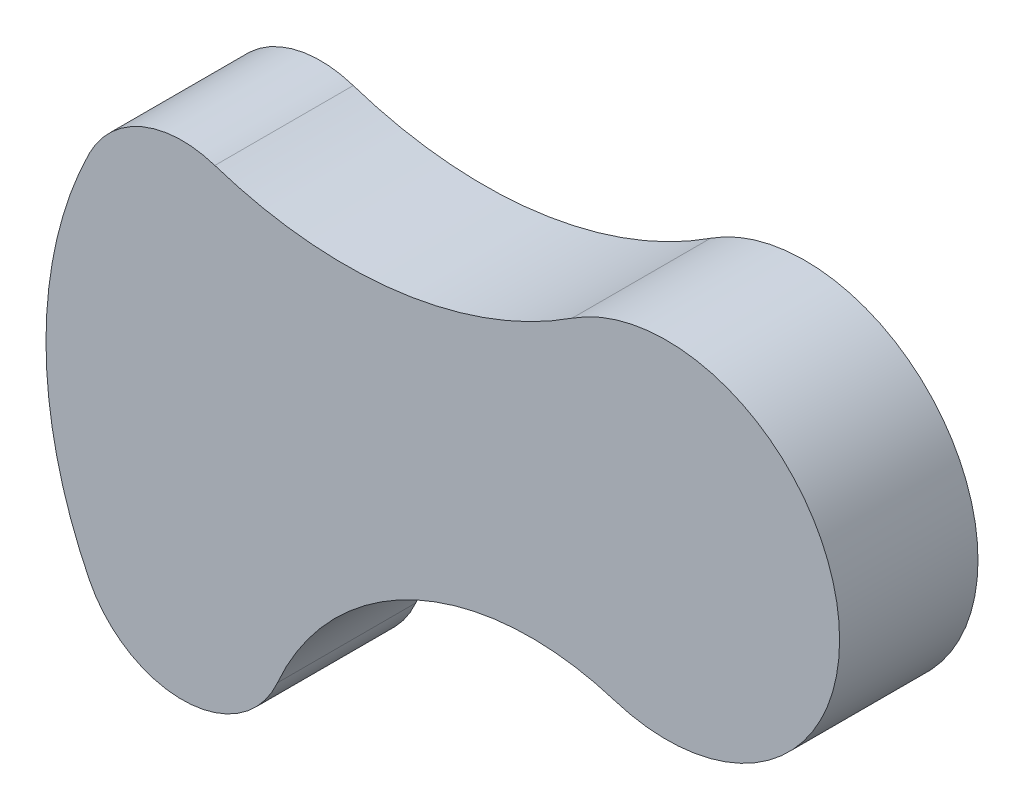
ISO-10303-21;
HEADER;
FILE_DESCRIPTION(('STEP AP214'),'2;1');
FILE_NAME('part.step','',(''),(''),'','','');
FILE_SCHEMA(('AUTOMOTIVE_DESIGN { 1 0 10303 214 1 1 1 1 }'));
ENDSEC;
DATA;
#1=APPLICATION_CONTEXT('core data for automotive mechanical design processes');
#2=APPLICATION_PROTOCOL_DEFINITION('international standard','automotive_design',2000,#1);
#3=PRODUCT_CONTEXT('',#1,'mechanical');
#4=PRODUCT('Part','Part','',(#3));
#5=PRODUCT_RELATED_PRODUCT_CATEGORY('part','',(#4));
#6=PRODUCT_DEFINITION_FORMATION('','',#4);
#7=PRODUCT_DEFINITION_CONTEXT('part definition',#1,'design');
#8=PRODUCT_DEFINITION('design','',#6,#7);
#9=PRODUCT_DEFINITION_SHAPE('','',#8);
#10=(LENGTH_UNIT() NAMED_UNIT(*) SI_UNIT(.MILLI.,.METRE.));
#11=(NAMED_UNIT(*) PLANE_ANGLE_UNIT() SI_UNIT($,.RADIAN.));
#12=(NAMED_UNIT(*) SI_UNIT($,.STERADIAN.) SOLID_ANGLE_UNIT());
#13=UNCERTAINTY_MEASURE_WITH_UNIT(LENGTH_MEASURE(1.E-05),#10,'distance_accuracy_value','');
#14=(GEOMETRIC_REPRESENTATION_CONTEXT(3) GLOBAL_UNCERTAINTY_ASSIGNED_CONTEXT((#13)) GLOBAL_UNIT_ASSIGNED_CONTEXT((#10,
#11,#12)) REPRESENTATION_CONTEXT('',''));
#15=CARTESIAN_POINT('',(0.,0.,0.));
#16=DIRECTION('',(0.,0.,1.));
#17=DIRECTION('',(1.,0.,0.));
#18=AXIS2_PLACEMENT_3D('',#15,#16,#17);
#19=CARTESIAN_POINT('',(-23.2142857142857,35.5998165553632,10.));
#20=DIRECTION('',(0.,0.,-1.));
#21=DIRECTION('',(-1.,0.,0.));
#22=AXIS2_PLACEMENT_3D('',#19,#20,#21);
#23=CYLINDRICAL_SURFACE('',#22,30.);
#24=CARTESIAN_POINT('',(-23.2142857142857,35.5998165553632,0.));
#25=DIRECTION('',(0.,0.,-1.));
#26=DIRECTION('',(1.,0.,0.));
#27=AXIS2_PLACEMENT_3D('',#24,#25,#26);
#28=CIRCLE('',#27,30.);
#29=CARTESIAN_POINT('',(-6.82773109243699,10.4705342809892,0.));
#30=VERTEX_POINT('',#29);
#31=CARTESIAN_POINT('',(-32.6428571428571,7.11996331107264,0.));
#32=VERTEX_POINT('',#31);
#33=EDGE_CURVE('E123',#30,#32,#28,.T.);
#34=ORIENTED_EDGE('',*,*,#33,.T.);
#35=DIRECTION('',(0.,0.,-1.));
#36=VECTOR('',#35,1.);
#37=CARTESIAN_POINT('',(-32.6428571428571,7.11996331107264,10.));
#38=LINE('',#37,#36);
#39=CARTESIAN_POINT('',(-32.6428571428571,7.11996331107264,10.));
#40=VERTEX_POINT('',#39);
#41=EDGE_CURVE('E11',#40,#32,#38,.T.);
#42=ORIENTED_EDGE('',*,*,#41,.F.);
#43=CARTESIAN_POINT('',(-23.2142857142857,35.5998165553632,10.));
#44=DIRECTION('',(0.,0.,-1.));
#45=DIRECTION('',(1.,0.,0.));
#46=AXIS2_PLACEMENT_3D('',#43,#44,#45);
#47=CIRCLE('',#46,30.);
#48=CARTESIAN_POINT('',(-6.82773109243699,10.4705342809892,10.));
#49=VERTEX_POINT('',#48);
#50=EDGE_CURVE('E133',#49,#40,#47,.T.);
#51=ORIENTED_EDGE('',*,*,#50,.F.);
#52=DIRECTION('',(0.,0.,-1.));
#53=VECTOR('',#52,1.);
#54=CARTESIAN_POINT('',(-6.82773109243699,10.4705342809892,10.));
#55=LINE('',#54,#53);
#56=EDGE_CURVE('E119',#49,#30,#55,.T.);
#57=ORIENTED_EDGE('',*,*,#56,.T.);
#58=EDGE_LOOP('',(#34,#42,#51,#57));
#59=FACE_BOUND('',#58,.T.);
#60=ADVANCED_FACE('F39',(#59),#23,.F.);
#61=CARTESIAN_POINT('',(-35.,0.,10.));
#62=DIRECTION('',(0.,0.,-1.));
#63=DIRECTION('',(-1.,0.,0.));
#64=AXIS2_PLACEMENT_3D('',#61,#62,#63);
#65=CYLINDRICAL_SURFACE('',#64,7.50000000000001);
#66=CARTESIAN_POINT('',(-35.,0.,0.));
#67=DIRECTION('',(0.,0.,1.));
#68=DIRECTION('',(1.,0.,0.));
#69=AXIS2_PLACEMENT_3D('',#66,#67,#68);
#70=CIRCLE('',#69,7.50000000000001);
#71=CARTESIAN_POINT('',(-41.7185481235821,3.33333333333333,0.));
#72=VERTEX_POINT('',#71);
#73=EDGE_CURVE('E126',#32,#72,#70,.T.);
#74=ORIENTED_EDGE('',*,*,#73,.T.);
#75=DIRECTION('',(0.,0.,-1.));
#76=VECTOR('',#75,1.);
#77=CARTESIAN_POINT('',(-41.7185481235821,3.33333333333333,10.));
#78=LINE('',#77,#76);
#79=CARTESIAN_POINT('',(-41.7185481235821,3.33333333333333,10.));
#80=VERTEX_POINT('',#79);
#81=EDGE_CURVE('E47',#80,#72,#78,.T.);
#82=ORIENTED_EDGE('',*,*,#81,.F.);
#83=CARTESIAN_POINT('',(-35.,0.,10.));
#84=DIRECTION('',(0.,0.,1.));
#85=DIRECTION('',(1.,0.,0.));
#86=AXIS2_PLACEMENT_3D('',#83,#84,#85);
#87=CIRCLE('',#86,7.50000000000001);
#88=EDGE_CURVE('E92',#40,#80,#87,.T.);
#89=ORIENTED_EDGE('',*,*,#88,.F.);
#90=ORIENTED_EDGE('',*,*,#41,.T.);
#91=EDGE_LOOP('',(#74,#82,#89,#90));
#92=FACE_BOUND('',#91,.T.);
#93=ADVANCED_FACE('F157',(#92),#65,.T.);
#94=CARTESIAN_POINT('',(-14.8443556292536,-10.,10.));
#95=DIRECTION('',(0.,0.,-1.));
#96=DIRECTION('',(-1.,0.,0.));
#97=AXIS2_PLACEMENT_3D('',#94,#95,#96);
#98=CYLINDRICAL_SURFACE('',#97,30.);
#99=CARTESIAN_POINT('',(-14.8443556292536,-10.,0.));
#100=DIRECTION('',(0.,0.,1.));
#101=DIRECTION('',(-1.,0.,0.));
#102=AXIS2_PLACEMENT_3D('',#99,#100,#101);
#103=CIRCLE('',#102,30.);
#104=CARTESIAN_POINT('',(-41.7185481235821,-23.3333333333334,0.));
#105=VERTEX_POINT('',#104);
#106=EDGE_CURVE('E128',#72,#105,#103,.T.);
#107=ORIENTED_EDGE('',*,*,#106,.T.);
#108=DIRECTION('',(0.,0.,-1.));
#109=VECTOR('',#108,1.);
#110=CARTESIAN_POINT('',(-41.7185481235821,-23.3333333333334,10.));
#111=LINE('',#110,#109);
#112=CARTESIAN_POINT('',(-41.7185481235821,-23.3333333333334,10.));
#113=VERTEX_POINT('',#112);
#114=EDGE_CURVE('E114',#113,#105,#111,.T.);
#115=ORIENTED_EDGE('',*,*,#114,.F.);
#116=CARTESIAN_POINT('',(-14.8443556292536,-10.,10.));
#117=DIRECTION('',(0.,0.,1.));
#118=DIRECTION('',(-1.,0.,0.));
#119=AXIS2_PLACEMENT_3D('',#116,#117,#118);
#120=CIRCLE('',#119,30.);
#121=EDGE_CURVE('E105',#80,#113,#120,.T.);
#122=ORIENTED_EDGE('',*,*,#121,.F.);
#123=ORIENTED_EDGE('',*,*,#81,.T.);
#124=EDGE_LOOP('',(#107,#115,#122,#123));
#125=FACE_BOUND('',#124,.T.);
#126=ADVANCED_FACE('F139',(#125),#98,.T.);
#127=CARTESIAN_POINT('',(-35.,-20.,10.));
#128=DIRECTION('',(0.,0.,-1.));
#129=DIRECTION('',(-1.,0.,0.));
#130=AXIS2_PLACEMENT_3D('',#127,#128,#129);
#131=CYLINDRICAL_SURFACE('',#130,7.50000000000001);
#132=CARTESIAN_POINT('',(-35.,-20.,0.));
#133=DIRECTION('',(0.,0.,1.));
#134=DIRECTION('',(1.,0.,0.));
#135=AXIS2_PLACEMENT_3D('',#132,#133,#134);
#136=CIRCLE('',#135,7.50000000000001);
#137=CARTESIAN_POINT('',(-28.1249417340479,-22.9972610563252,0.));
#138=VERTEX_POINT('',#137);
#139=EDGE_CURVE('E113',#105,#138,#136,.T.);
#140=ORIENTED_EDGE('',*,*,#139,.T.);
#141=DIRECTION('',(0.,0.,-1.));
#142=VECTOR('',#141,1.);
#143=CARTESIAN_POINT('',(-28.1249417340479,-22.9972610563252,10.));
#144=LINE('',#143,#142);
#145=CARTESIAN_POINT('',(-28.1249417340479,-22.9972610563252,10.));
#146=VERTEX_POINT('',#145);
#147=EDGE_CURVE('E110',#146,#138,#144,.T.);
#148=ORIENTED_EDGE('',*,*,#147,.F.);
#149=CARTESIAN_POINT('',(-35.,-20.,10.));
#150=DIRECTION('',(0.,0.,1.));
#151=DIRECTION('',(1.,0.,0.));
#152=AXIS2_PLACEMENT_3D('',#149,#150,#151);
#153=CIRCLE('',#152,7.50000000000001);
#154=EDGE_CURVE('E99',#113,#146,#153,.T.);
#155=ORIENTED_EDGE('',*,*,#154,.F.);
#156=ORIENTED_EDGE('',*,*,#114,.T.);
#157=EDGE_LOOP('',(#140,#148,#155,#156));
#158=FACE_BOUND('',#157,.T.);
#159=ADVANCED_FACE('F111',(#158),#131,.T.);
#160=CARTESIAN_POINT('',(-9.79145302484236,-30.9899572065259,10.));
#161=DIRECTION('',(0.,0.,-1.));
#162=DIRECTION('',(-1.,0.,0.));
#163=AXIS2_PLACEMENT_3D('',#160,#161,#162);
#164=CYLINDRICAL_SURFACE('',#163,20.);
#165=CARTESIAN_POINT('',(-9.79145302484236,-30.9899572065259,0.));
#166=DIRECTION('',(0.,0.,-1.));
#167=DIRECTION('',(-1.,0.,0.));
#168=AXIS2_PLACEMENT_3D('',#165,#166,#167);
#169=CIRCLE('',#168,20.);
#170=CARTESIAN_POINT('',(-3.76594347109321,-11.9192143102023,0.));
#171=VERTEX_POINT('',#170);
#172=EDGE_CURVE('E78',#138,#171,#169,.T.);
#173=ORIENTED_EDGE('',*,*,#172,.T.);
#174=DIRECTION('',(0.,0.,-1.));
#175=VECTOR('',#174,1.);
#176=CARTESIAN_POINT('',(-3.76594347109321,-11.9192143102023,10.));
#177=LINE('',#176,#175);
#178=CARTESIAN_POINT('',(-3.76594347109321,-11.9192143102023,10.));
#179=VERTEX_POINT('',#178);
#180=EDGE_CURVE('E115',#179,#171,#177,.T.);
#181=ORIENTED_EDGE('',*,*,#180,.F.);
#182=CARTESIAN_POINT('',(-9.79145302484236,-30.9899572065259,10.));
#183=DIRECTION('',(0.,0.,-1.));
#184=DIRECTION('',(-1.,0.,0.));
#185=AXIS2_PLACEMENT_3D('',#182,#183,#184);
#186=CIRCLE('',#185,20.);
#187=EDGE_CURVE('E103',#146,#179,#186,.T.);
#188=ORIENTED_EDGE('',*,*,#187,.F.);
#189=ORIENTED_EDGE('',*,*,#147,.T.);
#190=EDGE_LOOP('',(#173,#181,#188,#189));
#191=FACE_BOUND('',#190,.T.);
#192=ADVANCED_FACE('F117',(#191),#164,.F.);
#193=CARTESIAN_POINT('',(0.,0.,10.));
#194=DIRECTION('',(0.,0.,-1.));
#195=DIRECTION('',(-1.,0.,0.));
#196=AXIS2_PLACEMENT_3D('',#193,#194,#195);
#197=CYLINDRICAL_SURFACE('',#196,12.5);
#198=CARTESIAN_POINT('',(0.,0.,0.));
#199=DIRECTION('',(0.,0.,1.));
#200=DIRECTION('',(1.,0.,0.));
#201=AXIS2_PLACEMENT_3D('',#198,#199,#200);
#202=CIRCLE('',#201,12.5);
#203=EDGE_CURVE('E84',#171,#30,#202,.T.);
#204=ORIENTED_EDGE('',*,*,#203,.T.);
#205=ORIENTED_EDGE('',*,*,#56,.F.);
#206=CARTESIAN_POINT('',(0.,0.,10.));
#207=DIRECTION('',(0.,0.,1.));
#208=DIRECTION('',(1.,0.,0.));
#209=AXIS2_PLACEMENT_3D('',#206,#207,#208);
#210=CIRCLE('',#209,12.5);
#211=EDGE_CURVE('E55',#179,#49,#210,.T.);
#212=ORIENTED_EDGE('',*,*,#211,.F.);
#213=ORIENTED_EDGE('',*,*,#180,.T.);
#214=EDGE_LOOP('',(#204,#205,#212,#213));
#215=FACE_BOUND('',#214,.T.);
#216=ADVANCED_FACE('F146',(#215),#197,.T.);
#217=CARTESIAN_POINT('',(-11.6071428571429,17.7999082776816,10.));
#218=DIRECTION('',(0.,0.,1.));
#219=DIRECTION('',(1.,0.,0.));
#220=AXIS2_PLACEMENT_3D('',#217,#218,#219);
#221=PLANE('',#220);
#222=ORIENTED_EDGE('',*,*,#50,.T.);
#223=ORIENTED_EDGE('',*,*,#88,.T.);
#224=ORIENTED_EDGE('',*,*,#121,.T.);
#225=ORIENTED_EDGE('',*,*,#154,.T.);
#226=ORIENTED_EDGE('',*,*,#187,.T.);
#227=ORIENTED_EDGE('',*,*,#211,.T.);
#228=EDGE_LOOP('',(#222,#223,#224,#225,#226,#227));
#229=FACE_BOUND('',#228,.T.);
#230=ADVANCED_FACE('F101',(#229),#221,.T.);
#231=CARTESIAN_POINT('',(-11.6071428571429,17.7999082776816,0.));
#232=DIRECTION('',(0.,0.,1.));
#233=DIRECTION('',(1.,0.,0.));
#234=AXIS2_PLACEMENT_3D('',#231,#232,#233);
#235=PLANE('',#234);
#236=ORIENTED_EDGE('',*,*,#33,.F.);
#237=ORIENTED_EDGE('',*,*,#203,.F.);
#238=ORIENTED_EDGE('',*,*,#172,.F.);
#239=ORIENTED_EDGE('',*,*,#139,.F.);
#240=ORIENTED_EDGE('',*,*,#106,.F.);
#241=ORIENTED_EDGE('',*,*,#73,.F.);
#242=EDGE_LOOP('',(#236,#237,#238,#239,#240,#241));
#243=FACE_BOUND('',#242,.T.);
#244=ADVANCED_FACE('F142',(#243),#235,.F.);
#245=CLOSED_SHELL('',(#60,#93,#126,#159,#192,#216,#230,#244));
#246=MANIFOLD_SOLID_BREP('B2',#245);
#247=ADVANCED_BREP_SHAPE_REPRESENTATION('',(#18,#246),#14);
#248=SHAPE_DEFINITION_REPRESENTATION(#9,#247);
ENDSEC;
END-ISO-10303-21;
